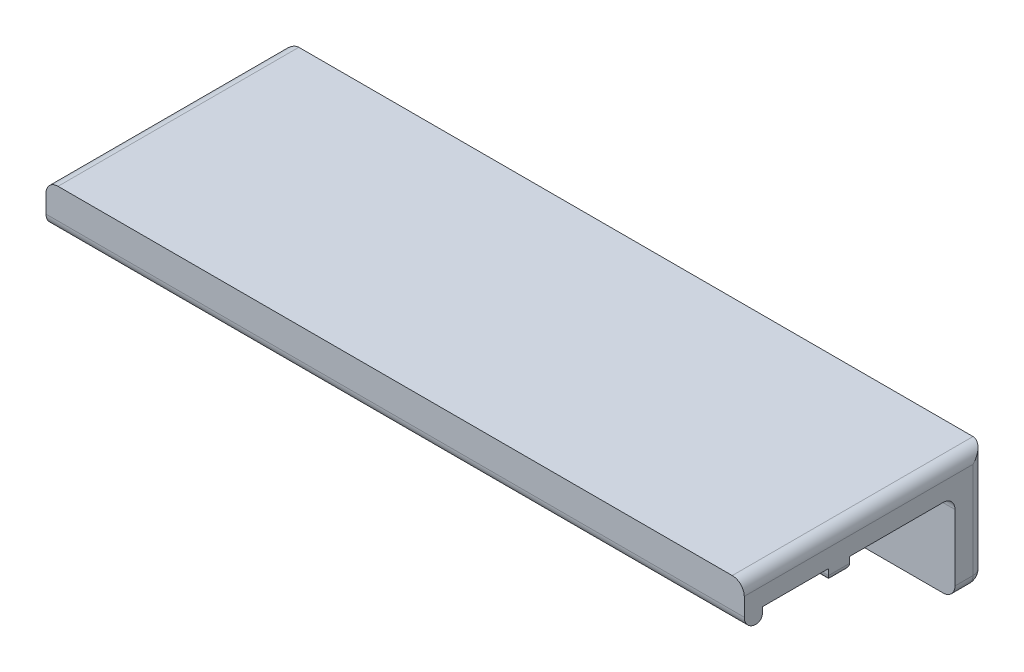
ISO-10303-21;
HEADER;
FILE_DESCRIPTION(('STEP AP214'),'2;1');
FILE_NAME('part.step','',(''),(''),'','','');
FILE_SCHEMA(('AUTOMOTIVE_DESIGN { 1 0 10303 214 1 1 1 1 }'));
ENDSEC;
DATA;
#1=APPLICATION_CONTEXT('core data for automotive mechanical design processes');
#2=APPLICATION_PROTOCOL_DEFINITION('international standard','automotive_design',2000,#1);
#3=PRODUCT_CONTEXT('',#1,'mechanical');
#4=PRODUCT('Part','Part','',(#3));
#5=PRODUCT_RELATED_PRODUCT_CATEGORY('part','',(#4));
#6=PRODUCT_DEFINITION_FORMATION('','',#4);
#7=PRODUCT_DEFINITION_CONTEXT('part definition',#1,'design');
#8=PRODUCT_DEFINITION('design','',#6,#7);
#9=PRODUCT_DEFINITION_SHAPE('','',#8);
#10=(LENGTH_UNIT() NAMED_UNIT(*) SI_UNIT(.MILLI.,.METRE.));
#11=(NAMED_UNIT(*) PLANE_ANGLE_UNIT() SI_UNIT($,.RADIAN.));
#12=(NAMED_UNIT(*) SI_UNIT($,.STERADIAN.) SOLID_ANGLE_UNIT());
#13=UNCERTAINTY_MEASURE_WITH_UNIT(LENGTH_MEASURE(1.E-05),#10,'distance_accuracy_value','');
#14=(GEOMETRIC_REPRESENTATION_CONTEXT(3) GLOBAL_UNCERTAINTY_ASSIGNED_CONTEXT((#13)) GLOBAL_UNIT_ASSIGNED_CONTEXT((#10,
#11,#12)) REPRESENTATION_CONTEXT('',''));
#15=CARTESIAN_POINT('',(0.,0.,0.));
#16=DIRECTION('',(0.,0.,1.));
#17=DIRECTION('',(1.,0.,0.));
#18=AXIS2_PLACEMENT_3D('',#15,#16,#17);
#19=CARTESIAN_POINT('',(0.,15.,40.));
#20=DIRECTION('',(0.,1.,0.));
#21=DIRECTION('',(0.,0.,1.));
#22=AXIS2_PLACEMENT_3D('',#19,#20,#21);
#23=PLANE('',#22);
#24=DIRECTION('',(0.,0.,-1.));
#25=VECTOR('',#24,1.);
#26=CARTESIAN_POINT('',(0.,15.,40.));
#27=LINE('',#26,#25);
#28=CARTESIAN_POINT('',(0.,15.,22.5));
#29=VERTEX_POINT('',#28);
#30=CARTESIAN_POINT('',(0.,15.,7.));
#31=VERTEX_POINT('',#30);
#32=EDGE_CURVE('E195',#29,#31,#27,.T.);
#33=ORIENTED_EDGE('',*,*,#32,.T.);
#34=DIRECTION('',(1.,0.,0.));
#35=VECTOR('',#34,1.);
#36=CARTESIAN_POINT('',(116.,15.,7.));
#37=LINE('',#36,#35);
#38=CARTESIAN_POINT('',(116.,15.,7.));
#39=VERTEX_POINT('',#38);
#40=EDGE_CURVE('E348',#31,#39,#37,.T.);
#41=ORIENTED_EDGE('',*,*,#40,.T.);
#42=DIRECTION('',(0.,0.,-1.));
#43=VECTOR('',#42,1.);
#44=CARTESIAN_POINT('',(116.,15.,40.));
#45=LINE('',#44,#43);
#46=CARTESIAN_POINT('',(116.,15.,22.5));
#47=VERTEX_POINT('',#46);
#48=EDGE_CURVE('E205',#47,#39,#45,.T.);
#49=ORIENTED_EDGE('',*,*,#48,.F.);
#50=DIRECTION('',(1.,0.,0.));
#51=VECTOR('',#50,1.);
#52=CARTESIAN_POINT('',(0.,15.,22.5));
#53=LINE('',#52,#51);
#54=EDGE_CURVE('E186',#29,#47,#53,.T.);
#55=ORIENTED_EDGE('',*,*,#54,.F.);
#56=EDGE_LOOP('',(#33,#41,#49,#55));
#57=FACE_BOUND('',#56,.T.);
#58=ADVANCED_FACE('F39',(#57),#23,.F.);
#59=DIRECTION('',(-1.,0.,0.));
#60=VECTOR('',#59,1.);
#61=CARTESIAN_POINT('',(0.,15.,26.));
#62=LINE('',#61,#60);
#63=CARTESIAN_POINT('',(116.,15.,26.));
#64=VERTEX_POINT('',#63);
#65=CARTESIAN_POINT('',(0.,15.,26.));
#66=VERTEX_POINT('',#65);
#67=EDGE_CURVE('E207',#64,#66,#62,.T.);
#68=ORIENTED_EDGE('',*,*,#67,.F.);
#69=CARTESIAN_POINT('',(116.,15.,37.));
#70=VERTEX_POINT('',#69);
#71=EDGE_CURVE('E202',#70,#64,#45,.T.);
#72=ORIENTED_EDGE('',*,*,#71,.F.);
#73=DIRECTION('',(1.,0.,0.));
#74=VECTOR('',#73,1.);
#75=CARTESIAN_POINT('',(0.,15.,37.));
#76=LINE('',#75,#74);
#77=CARTESIAN_POINT('',(0.,15.,37.));
#78=VERTEX_POINT('',#77);
#79=EDGE_CURVE('E206',#78,#70,#76,.T.);
#80=ORIENTED_EDGE('',*,*,#79,.F.);
#81=EDGE_CURVE('E201',#78,#66,#27,.T.);
#82=ORIENTED_EDGE('',*,*,#81,.T.);
#83=EDGE_LOOP('',(#68,#72,#80,#82));
#84=FACE_BOUND('',#83,.T.);
#85=ADVANCED_FACE('F375',(#84),#23,.F.);
#86=CARTESIAN_POINT('',(2.,2.,5.));
#87=DIRECTION('',(0.,0.,-1.));
#88=DIRECTION('',(-1.,0.,0.));
#89=AXIS2_PLACEMENT_3D('',#86,#87,#88);
#90=PLANE('',#89);
#91=CARTESIAN_POINT('',(96.,9.,5.));
#92=DIRECTION('',(0.,0.,1.));
#93=DIRECTION('',(1.,0.,0.));
#94=AXIS2_PLACEMENT_3D('',#91,#92,#93);
#95=CIRCLE('',#94,2.);
#96=CARTESIAN_POINT('',(98.,9.,5.));
#97=VERTEX_POINT('',#96);
#98=EDGE_CURVE('E233',#97,#97,#95,.T.);
#99=ORIENTED_EDGE('',*,*,#98,.F.);
#100=EDGE_LOOP('',(#99));
#101=FACE_BOUND('',#100,.T.);
#102=CARTESIAN_POINT('',(20.,9.,5.));
#103=DIRECTION('',(0.,0.,1.));
#104=DIRECTION('',(1.,0.,0.));
#105=AXIS2_PLACEMENT_3D('',#102,#103,#104);
#106=CIRCLE('',#105,2.);
#107=CARTESIAN_POINT('',(22.,9.,5.));
#108=VERTEX_POINT('',#107);
#109=EDGE_CURVE('E239',#108,#108,#106,.T.);
#110=ORIENTED_EDGE('',*,*,#109,.F.);
#111=EDGE_LOOP('',(#110));
#112=FACE_BOUND('',#111,.T.);
#113=DIRECTION('',(0.,1.,0.));
#114=VECTOR('',#113,1.);
#115=CARTESIAN_POINT('',(116.,2.00000000000001,5.));
#116=LINE('',#115,#114);
#117=CARTESIAN_POINT('',(116.,2.,5.));
#118=VERTEX_POINT('',#117);
#119=CARTESIAN_POINT('',(116.,13.,5.));
#120=VERTEX_POINT('',#119);
#121=EDGE_CURVE('E245',#118,#120,#116,.T.);
#122=ORIENTED_EDGE('',*,*,#121,.T.);
#123=DIRECTION('',(1.,0.,0.));
#124=VECTOR('',#123,1.);
#125=CARTESIAN_POINT('',(0.,13.,5.));
#126=LINE('',#125,#124);
#127=CARTESIAN_POINT('',(0.,13.,5.));
#128=VERTEX_POINT('',#127);
#129=EDGE_CURVE('E60',#120,#128,#126,.F.);
#130=ORIENTED_EDGE('',*,*,#129,.T.);
#131=DIRECTION('',(0.,-1.,0.));
#132=VECTOR('',#131,1.);
#133=CARTESIAN_POINT('',(0.,2.00000000000001,5.));
#134=LINE('',#133,#132);
#135=CARTESIAN_POINT('',(0.,2.00000000000001,5.));
#136=VERTEX_POINT('',#135);
#137=EDGE_CURVE('E247',#128,#136,#134,.T.);
#138=ORIENTED_EDGE('',*,*,#137,.T.);
#139=CARTESIAN_POINT('',(2.,2.,5.));
#140=DIRECTION('',(0.,0.,1.));
#141=DIRECTION('',(-1.,0.,0.));
#142=AXIS2_PLACEMENT_3D('',#139,#140,#141);
#143=CIRCLE('',#142,2.);
#144=CARTESIAN_POINT('',(2.00000000000001,0.,5.));
#145=VERTEX_POINT('',#144);
#146=EDGE_CURVE('E249',#136,#145,#143,.T.);
#147=ORIENTED_EDGE('',*,*,#146,.T.);
#148=DIRECTION('',(1.,0.,0.));
#149=VECTOR('',#148,1.);
#150=CARTESIAN_POINT('',(2.00000000000001,0.,5.));
#151=LINE('',#150,#149);
#152=CARTESIAN_POINT('',(114.,0.,5.));
#153=VERTEX_POINT('',#152);
#154=EDGE_CURVE('E251',#145,#153,#151,.T.);
#155=ORIENTED_EDGE('',*,*,#154,.T.);
#156=CARTESIAN_POINT('',(114.,2.,5.));
#157=DIRECTION('',(0.,0.,1.));
#158=DIRECTION('',(1.,0.,0.));
#159=AXIS2_PLACEMENT_3D('',#156,#157,#158);
#160=CIRCLE('',#159,2.);
#161=EDGE_CURVE('E253',#153,#118,#160,.T.);
#162=ORIENTED_EDGE('',*,*,#161,.T.);
#163=EDGE_LOOP('',(#122,#130,#138,#147,#155,#162));
#164=FACE_BOUND('',#163,.T.);
#165=ADVANCED_FACE('F411',(#101,#112,#164),#90,.F.);
#166=CARTESIAN_POINT('',(2.,2.,0.));
#167=DIRECTION('',(0.,0.,-1.));
#168=DIRECTION('',(-1.,0.,0.));
#169=AXIS2_PLACEMENT_3D('',#166,#167,#168);
#170=PLANE('',#169);
#171=CARTESIAN_POINT('',(20.,9.,0.));
#172=DIRECTION('',(0.,0.,1.));
#173=DIRECTION('',(1.,0.,0.));
#174=AXIS2_PLACEMENT_3D('',#171,#172,#173);
#175=CIRCLE('',#174,2.);
#176=CARTESIAN_POINT('',(22.,9.,0.));
#177=VERTEX_POINT('',#176);
#178=EDGE_CURVE('E236',#177,#177,#175,.T.);
#179=ORIENTED_EDGE('',*,*,#178,.T.);
#180=EDGE_LOOP('',(#179));
#181=FACE_BOUND('',#180,.T.);
#182=DIRECTION('',(1.,0.,0.));
#183=VECTOR('',#182,1.);
#184=CARTESIAN_POINT('',(2.00000000000001,2.,0.));
#185=LINE('',#184,#183);
#186=CARTESIAN_POINT('',(114.,2.,0.));
#187=VERTEX_POINT('',#186);
#188=CARTESIAN_POINT('',(2.,2.,0.));
#189=VERTEX_POINT('',#188);
#190=EDGE_CURVE('E278',#187,#189,#185,.F.);
#191=ORIENTED_EDGE('',*,*,#190,.T.);
#192=DIRECTION('',(0.,-1.,0.));
#193=VECTOR('',#192,1.);
#194=CARTESIAN_POINT('',(2.,20.,0.));
#195=LINE('',#194,#193);
#196=CARTESIAN_POINT('',(2.,20.,0.));
#197=VERTEX_POINT('',#196);
#198=EDGE_CURVE('E280',#189,#197,#195,.F.);
#199=ORIENTED_EDGE('',*,*,#198,.T.);
#200=DIRECTION('',(-1.,0.,0.));
#201=VECTOR('',#200,1.);
#202=CARTESIAN_POINT('',(0.,20.,0.));
#203=LINE('',#202,#201);
#204=CARTESIAN_POINT('',(114.,20.,0.));
#205=VERTEX_POINT('',#204);
#206=EDGE_CURVE('E242',#205,#197,#203,.T.);
#207=ORIENTED_EDGE('',*,*,#206,.F.);
#208=DIRECTION('',(0.,1.,0.));
#209=VECTOR('',#208,1.);
#210=CARTESIAN_POINT('',(114.,2.,0.));
#211=LINE('',#210,#209);
#212=EDGE_CURVE('E276',#205,#187,#211,.F.);
#213=ORIENTED_EDGE('',*,*,#212,.T.);
#214=EDGE_LOOP('',(#191,#199,#207,#213));
#215=FACE_BOUND('',#214,.T.);
#216=CARTESIAN_POINT('',(96.,9.,0.));
#217=DIRECTION('',(0.,0.,1.));
#218=DIRECTION('',(1.,0.,0.));
#219=AXIS2_PLACEMENT_3D('',#216,#217,#218);
#220=CIRCLE('',#219,2.);
#221=CARTESIAN_POINT('',(98.,9.,0.));
#222=VERTEX_POINT('',#221);
#223=EDGE_CURVE('E232',#222,#222,#220,.T.);
#224=ORIENTED_EDGE('',*,*,#223,.T.);
#225=EDGE_LOOP('',(#224));
#226=FACE_BOUND('',#225,.T.);
#227=ADVANCED_FACE('F438',(#181,#215,#226),#170,.T.);
#228=CARTESIAN_POINT('',(116.,2.00000000000001,5.));
#229=DIRECTION('',(-1.,0.,0.));
#230=DIRECTION('',(0.,0.,1.));
#231=AXIS2_PLACEMENT_3D('',#228,#229,#230);
#232=PLANE('',#231);
#233=DIRECTION('',(0.,1.,0.));
#234=VECTOR('',#233,1.);
#235=CARTESIAN_POINT('',(116.,13.,26.));
#236=LINE('',#235,#234);
#237=CARTESIAN_POINT('',(116.,14.,26.));
#238=VERTEX_POINT('',#237);
#239=EDGE_CURVE('E363',#238,#64,#236,.T.);
#240=ORIENTED_EDGE('',*,*,#239,.F.);
#241=DIRECTION('',(0.,0.,1.));
#242=VECTOR('',#241,1.);
#243=CARTESIAN_POINT('',(116.,14.,22.5));
#244=LINE('',#243,#242);
#245=CARTESIAN_POINT('',(116.,14.,22.5));
#246=VERTEX_POINT('',#245);
#247=EDGE_CURVE('E339',#238,#246,#244,.F.);
#248=ORIENTED_EDGE('',*,*,#247,.T.);
#249=DIRECTION('',(0.,1.,0.));
#250=VECTOR('',#249,1.);
#251=CARTESIAN_POINT('',(116.,13.,22.5));
#252=LINE('',#251,#250);
#253=EDGE_CURVE('E191',#246,#47,#252,.T.);
#254=ORIENTED_EDGE('',*,*,#253,.T.);
#255=ORIENTED_EDGE('',*,*,#48,.T.);
#256=CARTESIAN_POINT('',(116.,13.,7.));
#257=DIRECTION('',(-1.,0.,0.));
#258=DIRECTION('',(0.,0.,1.));
#259=AXIS2_PLACEMENT_3D('',#256,#257,#258);
#260=CIRCLE('',#259,2.);
#261=EDGE_CURVE('E47',#39,#120,#260,.T.);
#262=ORIENTED_EDGE('',*,*,#261,.T.);
#263=ORIENTED_EDGE('',*,*,#121,.F.);
#264=DIRECTION('',(0.,0.,-1.));
#265=VECTOR('',#264,1.);
#266=CARTESIAN_POINT('',(116.,2.,5.));
#267=LINE('',#266,#265);
#268=CARTESIAN_POINT('',(116.,2.,2.));
#269=VERTEX_POINT('',#268);
#270=EDGE_CURVE('E255',#118,#269,#267,.T.);
#271=ORIENTED_EDGE('',*,*,#270,.T.);
#272=DIRECTION('',(0.,1.,0.));
#273=VECTOR('',#272,1.);
#274=CARTESIAN_POINT('',(116.,20.,2.));
#275=LINE('',#274,#273);
#276=CARTESIAN_POINT('',(116.,18.,2.));
#277=VERTEX_POINT('',#276);
#278=EDGE_CURVE('E299',#269,#277,#275,.T.);
#279=ORIENTED_EDGE('',*,*,#278,.T.);
#280=DIRECTION('',(0.,0.,-1.));
#281=VECTOR('',#280,1.);
#282=CARTESIAN_POINT('',(116.,18.,5.));
#283=LINE('',#282,#281);
#284=CARTESIAN_POINT('',(116.,18.,40.));
#285=VERTEX_POINT('',#284);
#286=EDGE_CURVE('E297',#277,#285,#283,.F.);
#287=ORIENTED_EDGE('',*,*,#286,.T.);
#288=DIRECTION('',(0.,1.,0.));
#289=VECTOR('',#288,1.);
#290=CARTESIAN_POINT('',(116.,20.,40.));
#291=LINE('',#290,#289);
#292=CARTESIAN_POINT('',(116.,15.,40.));
#293=VERTEX_POINT('',#292);
#294=EDGE_CURVE('E223',#293,#285,#291,.T.);
#295=ORIENTED_EDGE('',*,*,#294,.F.);
#296=CARTESIAN_POINT('',(116.,15.,38.));
#297=DIRECTION('',(-1.,0.,0.));
#298=DIRECTION('',(0.,0.,1.));
#299=AXIS2_PLACEMENT_3D('',#296,#297,#298);
#300=CIRCLE('',#299,2.);
#301=CARTESIAN_POINT('',(116.,13.,38.));
#302=VERTEX_POINT('',#301);
#303=EDGE_CURVE('E301',#293,#302,#300,.F.);
#304=ORIENTED_EDGE('',*,*,#303,.T.);
#305=CARTESIAN_POINT('',(116.,14.,38.));
#306=DIRECTION('',(-1.,0.,0.));
#307=DIRECTION('',(0.,0.,1.));
#308=AXIS2_PLACEMENT_3D('',#305,#306,#307);
#309=CIRCLE('',#308,1.);
#310=CARTESIAN_POINT('',(116.,14.,37.));
#311=VERTEX_POINT('',#310);
#312=EDGE_CURVE('E337',#302,#311,#309,.F.);
#313=ORIENTED_EDGE('',*,*,#312,.T.);
#314=DIRECTION('',(0.,1.,0.));
#315=VECTOR('',#314,1.);
#316=CARTESIAN_POINT('',(116.,13.,37.));
#317=LINE('',#316,#315);
#318=EDGE_CURVE('E210',#311,#70,#317,.T.);
#319=ORIENTED_EDGE('',*,*,#318,.T.);
#320=ORIENTED_EDGE('',*,*,#71,.T.);
#321=EDGE_LOOP('',(#240,#248,#254,#255,#262,#263,#271,#279,#287,#295,#304,#313,#319,#320));
#322=FACE_BOUND('',#321,.T.);
#323=ADVANCED_FACE('F361',(#322),#232,.F.);
#324=CARTESIAN_POINT('',(0.,20.,5.));
#325=DIRECTION('',(0.,-1.,0.));
#326=DIRECTION('',(0.,0.,-1.));
#327=AXIS2_PLACEMENT_3D('',#324,#325,#326);
#328=PLANE('',#327);
#329=ORIENTED_EDGE('',*,*,#206,.T.);
#330=DIRECTION('',(0.,0.,-1.));
#331=VECTOR('',#330,1.);
#332=CARTESIAN_POINT('',(2.,20.,5.));
#333=LINE('',#332,#331);
#334=CARTESIAN_POINT('',(2.,20.,40.));
#335=VERTEX_POINT('',#334);
#336=EDGE_CURVE('E306',#197,#335,#333,.F.);
#337=ORIENTED_EDGE('',*,*,#336,.T.);
#338=DIRECTION('',(-1.,0.,0.));
#339=VECTOR('',#338,1.);
#340=CARTESIAN_POINT('',(0.,20.,40.));
#341=LINE('',#340,#339);
#342=CARTESIAN_POINT('',(114.,20.,40.));
#343=VERTEX_POINT('',#342);
#344=EDGE_CURVE('E226',#343,#335,#341,.T.);
#345=ORIENTED_EDGE('',*,*,#344,.F.);
#346=DIRECTION('',(0.,0.,-1.));
#347=VECTOR('',#346,1.);
#348=CARTESIAN_POINT('',(114.,20.,5.));
#349=LINE('',#348,#347);
#350=EDGE_CURVE('E304',#343,#205,#349,.T.);
#351=ORIENTED_EDGE('',*,*,#350,.T.);
#352=EDGE_LOOP('',(#329,#337,#345,#351));
#353=FACE_BOUND('',#352,.T.);
#354=ADVANCED_FACE('F453',(#353),#328,.F.);
#355=CARTESIAN_POINT('',(0.,2.00000000000001,5.));
#356=DIRECTION('',(1.,0.,0.));
#357=DIRECTION('',(0.,0.,-1.));
#358=AXIS2_PLACEMENT_3D('',#355,#356,#357);
#359=PLANE('',#358);
#360=DIRECTION('',(0.,1.,0.));
#361=VECTOR('',#360,1.);
#362=CARTESIAN_POINT('',(0.,13.,22.5));
#363=LINE('',#362,#361);
#364=CARTESIAN_POINT('',(0.,14.,22.5));
#365=VERTEX_POINT('',#364);
#366=EDGE_CURVE('E181',#365,#29,#363,.T.);
#367=ORIENTED_EDGE('',*,*,#366,.F.);
#368=DIRECTION('',(0.,0.,-1.));
#369=VECTOR('',#368,1.);
#370=CARTESIAN_POINT('',(0.,14.,26.));
#371=LINE('',#370,#369);
#372=CARTESIAN_POINT('',(0.,14.,26.));
#373=VERTEX_POINT('',#372);
#374=EDGE_CURVE('E344',#365,#373,#371,.F.);
#375=ORIENTED_EDGE('',*,*,#374,.T.);
#376=DIRECTION('',(0.,1.,0.));
#377=VECTOR('',#376,1.);
#378=CARTESIAN_POINT('',(0.,13.,26.));
#379=LINE('',#378,#377);
#380=EDGE_CURVE('E213',#373,#66,#379,.T.);
#381=ORIENTED_EDGE('',*,*,#380,.T.);
#382=ORIENTED_EDGE('',*,*,#81,.F.);
#383=DIRECTION('',(0.,1.,0.));
#384=VECTOR('',#383,1.);
#385=CARTESIAN_POINT('',(0.,13.,37.));
#386=LINE('',#385,#384);
#387=CARTESIAN_POINT('',(0.,14.,37.));
#388=VERTEX_POINT('',#387);
#389=EDGE_CURVE('E218',#388,#78,#386,.T.);
#390=ORIENTED_EDGE('',*,*,#389,.F.);
#391=CARTESIAN_POINT('',(0.,14.,38.));
#392=DIRECTION('',(1.,0.,0.));
#393=DIRECTION('',(0.,0.,-1.));
#394=AXIS2_PLACEMENT_3D('',#391,#392,#393);
#395=CIRCLE('',#394,1.);
#396=CARTESIAN_POINT('',(0.,13.,38.));
#397=VERTEX_POINT('',#396);
#398=EDGE_CURVE('E342',#388,#397,#395,.F.);
#399=ORIENTED_EDGE('',*,*,#398,.T.);
#400=CARTESIAN_POINT('',(0.,15.,38.));
#401=DIRECTION('',(1.,0.,0.));
#402=DIRECTION('',(0.,0.,-1.));
#403=AXIS2_PLACEMENT_3D('',#400,#401,#402);
#404=CIRCLE('',#403,2.);
#405=CARTESIAN_POINT('',(0.,15.,40.));
#406=VERTEX_POINT('',#405);
#407=EDGE_CURVE('E274',#397,#406,#404,.F.);
#408=ORIENTED_EDGE('',*,*,#407,.T.);
#409=DIRECTION('',(0.,-1.,0.));
#410=VECTOR('',#409,1.);
#411=CARTESIAN_POINT('',(0.,20.,40.));
#412=LINE('',#411,#410);
#413=CARTESIAN_POINT('',(0.,18.,40.));
#414=VERTEX_POINT('',#413);
#415=EDGE_CURVE('E220',#414,#406,#412,.T.);
#416=ORIENTED_EDGE('',*,*,#415,.F.);
#417=DIRECTION('',(0.,0.,-1.));
#418=VECTOR('',#417,1.);
#419=CARTESIAN_POINT('',(0.,18.,5.));
#420=LINE('',#419,#418);
#421=CARTESIAN_POINT('',(0.,18.,2.));
#422=VERTEX_POINT('',#421);
#423=EDGE_CURVE('E269',#414,#422,#420,.T.);
#424=ORIENTED_EDGE('',*,*,#423,.T.);
#425=DIRECTION('',(0.,-1.,0.));
#426=VECTOR('',#425,1.);
#427=CARTESIAN_POINT('',(0.,2.00000000000001,2.));
#428=LINE('',#427,#426);
#429=CARTESIAN_POINT('',(0.,2.00000000000001,2.));
#430=VERTEX_POINT('',#429);
#431=EDGE_CURVE('E271',#422,#430,#428,.T.);
#432=ORIENTED_EDGE('',*,*,#431,.T.);
#433=DIRECTION('',(0.,0.,-1.));
#434=VECTOR('',#433,1.);
#435=CARTESIAN_POINT('',(0.,2.00000000000001,5.));
#436=LINE('',#435,#434);
#437=EDGE_CURVE('E266',#136,#430,#436,.T.);
#438=ORIENTED_EDGE('',*,*,#437,.F.);
#439=ORIENTED_EDGE('',*,*,#137,.F.);
#440=CARTESIAN_POINT('',(0.,13.,7.));
#441=DIRECTION('',(1.,0.,0.));
#442=DIRECTION('',(0.,0.,-1.));
#443=AXIS2_PLACEMENT_3D('',#440,#441,#442);
#444=CIRCLE('',#443,2.);
#445=EDGE_CURVE('E11',#128,#31,#444,.T.);
#446=ORIENTED_EDGE('',*,*,#445,.T.);
#447=ORIENTED_EDGE('',*,*,#32,.F.);
#448=EDGE_LOOP('',(#367,#375,#381,#382,#390,#399,#408,#416,#424,#432,#438,#439,#446,#447));
#449=FACE_BOUND('',#448,.T.);
#450=ADVANCED_FACE('F196',(#449),#359,.F.);
#451=CARTESIAN_POINT('',(2.,2.,5.));
#452=DIRECTION('',(0.,0.,-1.));
#453=DIRECTION('',(-1.,0.,0.));
#454=AXIS2_PLACEMENT_3D('',#451,#452,#453);
#455=CYLINDRICAL_SURFACE('',#454,2.);
#456=ORIENTED_EDGE('',*,*,#437,.T.);
#457=CARTESIAN_POINT('',(2.,2.,2.));
#458=DIRECTION('',(0.,0.,-1.));
#459=DIRECTION('',(-1.,0.,0.));
#460=AXIS2_PLACEMENT_3D('',#457,#458,#459);
#461=CIRCLE('',#460,2.);
#462=CARTESIAN_POINT('',(2.00000000000001,0.,2.));
#463=VERTEX_POINT('',#462);
#464=EDGE_CURVE('E282',#430,#463,#461,.F.);
#465=ORIENTED_EDGE('',*,*,#464,.T.);
#466=DIRECTION('',(0.,0.,-1.));
#467=VECTOR('',#466,1.);
#468=CARTESIAN_POINT('',(2.00000000000001,0.,5.));
#469=LINE('',#468,#467);
#470=EDGE_CURVE('E263',#145,#463,#469,.T.);
#471=ORIENTED_EDGE('',*,*,#470,.F.);
#472=ORIENTED_EDGE('',*,*,#146,.F.);
#473=EDGE_LOOP('',(#456,#465,#471,#472));
#474=FACE_BOUND('',#473,.T.);
#475=ADVANCED_FACE('F407',(#474),#455,.T.);
#476=CARTESIAN_POINT('',(2.00000000000001,0.,5.));
#477=DIRECTION('',(0.,1.,0.));
#478=DIRECTION('',(0.,0.,1.));
#479=AXIS2_PLACEMENT_3D('',#476,#477,#478);
#480=PLANE('',#479);
#481=ORIENTED_EDGE('',*,*,#470,.T.);
#482=DIRECTION('',(1.,0.,0.));
#483=VECTOR('',#482,1.);
#484=CARTESIAN_POINT('',(114.,0.,2.));
#485=LINE('',#484,#483);
#486=CARTESIAN_POINT('',(114.,0.,2.));
#487=VERTEX_POINT('',#486);
#488=EDGE_CURVE('E284',#463,#487,#485,.T.);
#489=ORIENTED_EDGE('',*,*,#488,.T.);
#490=DIRECTION('',(0.,0.,-1.));
#491=VECTOR('',#490,1.);
#492=CARTESIAN_POINT('',(114.,0.,5.));
#493=LINE('',#492,#491);
#494=EDGE_CURVE('E260',#153,#487,#493,.T.);
#495=ORIENTED_EDGE('',*,*,#494,.F.);
#496=ORIENTED_EDGE('',*,*,#154,.F.);
#497=EDGE_LOOP('',(#481,#489,#495,#496));
#498=FACE_BOUND('',#497,.T.);
#499=ADVANCED_FACE('F445',(#498),#480,.F.);
#500=CARTESIAN_POINT('',(114.,2.,5.));
#501=DIRECTION('',(0.,0.,-1.));
#502=DIRECTION('',(-1.,0.,0.));
#503=AXIS2_PLACEMENT_3D('',#500,#501,#502);
#504=CYLINDRICAL_SURFACE('',#503,2.);
#505=ORIENTED_EDGE('',*,*,#494,.T.);
#506=CARTESIAN_POINT('',(114.,2.,2.));
#507=DIRECTION('',(0.,0.,-1.));
#508=DIRECTION('',(-1.,0.,0.));
#509=AXIS2_PLACEMENT_3D('',#506,#507,#508);
#510=CIRCLE('',#509,2.);
#511=EDGE_CURVE('E286',#487,#269,#510,.F.);
#512=ORIENTED_EDGE('',*,*,#511,.T.);
#513=ORIENTED_EDGE('',*,*,#270,.F.);
#514=ORIENTED_EDGE('',*,*,#161,.F.);
#515=EDGE_LOOP('',(#505,#512,#513,#514));
#516=FACE_BOUND('',#515,.T.);
#517=ADVANCED_FACE('F435',(#516),#504,.T.);
#518=CARTESIAN_POINT('',(20.,9.,5.));
#519=DIRECTION('',(0.,0.,-1.));
#520=DIRECTION('',(-1.,0.,0.));
#521=AXIS2_PLACEMENT_3D('',#518,#519,#520);
#522=CYLINDRICAL_SURFACE('',#521,2.);
#523=ORIENTED_EDGE('',*,*,#109,.T.);
#524=EDGE_LOOP('',(#523));
#525=FACE_BOUND('',#524,.T.);
#526=ORIENTED_EDGE('',*,*,#178,.F.);
#527=EDGE_LOOP('',(#526));
#528=FACE_BOUND('',#527,.T.);
#529=ADVANCED_FACE('F431',(#525,#528),#522,.F.);
#530=CARTESIAN_POINT('',(96.,9.,5.));
#531=DIRECTION('',(0.,0.,-1.));
#532=DIRECTION('',(-1.,0.,0.));
#533=AXIS2_PLACEMENT_3D('',#530,#531,#532);
#534=CYLINDRICAL_SURFACE('',#533,2.);
#535=ORIENTED_EDGE('',*,*,#98,.T.);
#536=EDGE_LOOP('',(#535));
#537=FACE_BOUND('',#536,.T.);
#538=ORIENTED_EDGE('',*,*,#223,.F.);
#539=EDGE_LOOP('',(#538));
#540=FACE_BOUND('',#539,.T.);
#541=ADVANCED_FACE('F428',(#537,#540),#534,.F.);
#542=CARTESIAN_POINT('',(0.,0.,40.));
#543=DIRECTION('',(0.,0.,1.));
#544=DIRECTION('',(1.,0.,0.));
#545=AXIS2_PLACEMENT_3D('',#542,#543,#544);
#546=PLANE('',#545);
#547=ORIENTED_EDGE('',*,*,#415,.T.);
#548=DIRECTION('',(-1.,0.,0.));
#549=VECTOR('',#548,1.);
#550=CARTESIAN_POINT('',(0.,15.,40.));
#551=LINE('',#550,#549);
#552=EDGE_CURVE('E295',#406,#293,#551,.F.);
#553=ORIENTED_EDGE('',*,*,#552,.T.);
#554=ORIENTED_EDGE('',*,*,#294,.T.);
#555=CARTESIAN_POINT('',(114.,18.,40.));
#556=DIRECTION('',(0.,0.,1.));
#557=DIRECTION('',(1.,0.,0.));
#558=AXIS2_PLACEMENT_3D('',#555,#556,#557);
#559=CIRCLE('',#558,2.);
#560=EDGE_CURVE('E291',#285,#343,#559,.T.);
#561=ORIENTED_EDGE('',*,*,#560,.T.);
#562=ORIENTED_EDGE('',*,*,#344,.T.);
#563=CARTESIAN_POINT('',(2.,18.,40.));
#564=DIRECTION('',(0.,0.,1.));
#565=DIRECTION('',(1.,0.,0.));
#566=AXIS2_PLACEMENT_3D('',#563,#564,#565);
#567=CIRCLE('',#566,2.);
#568=EDGE_CURVE('E293',#335,#414,#567,.T.);
#569=ORIENTED_EDGE('',*,*,#568,.T.);
#570=EDGE_LOOP('',(#547,#553,#554,#561,#562,#569));
#571=FACE_BOUND('',#570,.T.);
#572=ADVANCED_FACE('F394',(#571),#546,.T.);
#573=CARTESIAN_POINT('',(0.,13.,37.));
#574=DIRECTION('',(0.,0.,1.));
#575=DIRECTION('',(1.,0.,0.));
#576=AXIS2_PLACEMENT_3D('',#573,#574,#575);
#577=PLANE('',#576);
#578=ORIENTED_EDGE('',*,*,#318,.F.);
#579=DIRECTION('',(1.,0.,0.));
#580=VECTOR('',#579,1.);
#581=CARTESIAN_POINT('',(0.,14.,37.));
#582=LINE('',#581,#580);
#583=EDGE_CURVE('E346',#311,#388,#582,.F.);
#584=ORIENTED_EDGE('',*,*,#583,.T.);
#585=ORIENTED_EDGE('',*,*,#389,.T.);
#586=ORIENTED_EDGE('',*,*,#79,.T.);
#587=EDGE_LOOP('',(#578,#584,#585,#586));
#588=FACE_BOUND('',#587,.T.);
#589=ADVANCED_FACE('F381',(#588),#577,.F.);
#590=CARTESIAN_POINT('',(0.,13.,22.5));
#591=DIRECTION('',(0.,0.,1.));
#592=DIRECTION('',(1.,0.,0.));
#593=AXIS2_PLACEMENT_3D('',#590,#591,#592);
#594=PLANE('',#593);
#595=ORIENTED_EDGE('',*,*,#253,.F.);
#596=DIRECTION('',(1.,0.,0.));
#597=VECTOR('',#596,1.);
#598=CARTESIAN_POINT('',(0.,14.,22.5));
#599=LINE('',#598,#597);
#600=EDGE_CURVE('E188',#246,#365,#599,.F.);
#601=ORIENTED_EDGE('',*,*,#600,.T.);
#602=ORIENTED_EDGE('',*,*,#366,.T.);
#603=ORIENTED_EDGE('',*,*,#54,.T.);
#604=EDGE_LOOP('',(#595,#601,#602,#603));
#605=FACE_BOUND('',#604,.T.);
#606=ADVANCED_FACE('F184',(#605),#594,.F.);
#607=CARTESIAN_POINT('',(0.,13.,26.));
#608=DIRECTION('',(0.,0.,-1.));
#609=DIRECTION('',(-1.,0.,0.));
#610=AXIS2_PLACEMENT_3D('',#607,#608,#609);
#611=PLANE('',#610);
#612=ORIENTED_EDGE('',*,*,#380,.F.);
#613=DIRECTION('',(-1.,0.,0.));
#614=VECTOR('',#613,1.);
#615=CARTESIAN_POINT('',(116.,14.,26.));
#616=LINE('',#615,#614);
#617=EDGE_CURVE('E334',#373,#238,#616,.F.);
#618=ORIENTED_EDGE('',*,*,#617,.T.);
#619=ORIENTED_EDGE('',*,*,#239,.T.);
#620=ORIENTED_EDGE('',*,*,#67,.T.);
#621=EDGE_LOOP('',(#612,#618,#619,#620));
#622=FACE_BOUND('',#621,.T.);
#623=ADVANCED_FACE('F377',(#622),#611,.F.);
#624=CARTESIAN_POINT('',(0.,13.,0.));
#625=DIRECTION('',(0.,-1.,0.));
#626=DIRECTION('',(0.,0.,-1.));
#627=AXIS2_PLACEMENT_3D('',#624,#625,#626);
#628=PLANE('',#627);
#629=DIRECTION('',(0.,0.,1.));
#630=VECTOR('',#629,1.);
#631=CARTESIAN_POINT('',(115.,13.,26.));
#632=LINE('',#631,#630);
#633=CARTESIAN_POINT('',(115.,13.,23.5));
#634=VERTEX_POINT('',#633);
#635=CARTESIAN_POINT('',(115.,13.,25.));
#636=VERTEX_POINT('',#635);
#637=EDGE_CURVE('E329',#634,#636,#632,.T.);
#638=ORIENTED_EDGE('',*,*,#637,.T.);
#639=DIRECTION('',(-1.,0.,0.));
#640=VECTOR('',#639,1.);
#641=CARTESIAN_POINT('',(0.,13.,25.));
#642=LINE('',#641,#640);
#643=CARTESIAN_POINT('',(1.,13.,25.));
#644=VERTEX_POINT('',#643);
#645=EDGE_CURVE('E331',#636,#644,#642,.T.);
#646=ORIENTED_EDGE('',*,*,#645,.T.);
#647=DIRECTION('',(0.,0.,-1.));
#648=VECTOR('',#647,1.);
#649=CARTESIAN_POINT('',(1.,13.,22.5));
#650=LINE('',#649,#648);
#651=CARTESIAN_POINT('',(1.,13.,23.5));
#652=VERTEX_POINT('',#651);
#653=EDGE_CURVE('E308',#644,#652,#650,.T.);
#654=ORIENTED_EDGE('',*,*,#653,.T.);
#655=DIRECTION('',(1.,0.,0.));
#656=VECTOR('',#655,1.);
#657=CARTESIAN_POINT('',(116.,13.,23.5));
#658=LINE('',#657,#656);
#659=EDGE_CURVE('E327',#652,#634,#658,.T.);
#660=ORIENTED_EDGE('',*,*,#659,.T.);
#661=EDGE_LOOP('',(#638,#646,#654,#660));
#662=FACE_BOUND('',#661,.T.);
#663=ADVANCED_FACE('F483',(#662),#628,.T.);
#664=CARTESIAN_POINT('',(114.,18.,5.));
#665=DIRECTION('',(0.,0.,-1.));
#666=DIRECTION('',(-1.,0.,0.));
#667=AXIS2_PLACEMENT_3D('',#664,#665,#666);
#668=CYLINDRICAL_SURFACE('',#667,2.);
#669=ORIENTED_EDGE('',*,*,#560,.F.);
#670=ORIENTED_EDGE('',*,*,#286,.F.);
#671=CARTESIAN_POINT('',(114.,18.,2.));
#672=DIRECTION('',(0.,-0.707106781186547,-0.707106781186547));
#673=DIRECTION('',(0.,0.707106781186547,-0.707106781186547));
#674=AXIS2_PLACEMENT_3D('',#671,#672,#673);
#675=ELLIPSE('',#674,2.82842712474619,2.);
#676=EDGE_CURVE('E192',#205,#277,#675,.T.);
#677=ORIENTED_EDGE('',*,*,#676,.F.);
#678=ORIENTED_EDGE('',*,*,#350,.F.);
#679=EDGE_LOOP('',(#669,#670,#677,#678));
#680=FACE_BOUND('',#679,.T.);
#681=ADVANCED_FACE('F479',(#680),#668,.T.);
#682=CARTESIAN_POINT('',(114.,2.00000000000001,2.));
#683=DIRECTION('',(0.,-1.,0.));
#684=DIRECTION('',(0.,0.,-1.));
#685=AXIS2_PLACEMENT_3D('',#682,#683,#684);
#686=CYLINDRICAL_SURFACE('',#685,2.);
#687=ORIENTED_EDGE('',*,*,#676,.T.);
#688=ORIENTED_EDGE('',*,*,#278,.F.);
#689=CARTESIAN_POINT('',(114.,2.,2.));
#690=DIRECTION('',(0.,-1.,0.));
#691=DIRECTION('',(0.,0.,-1.));
#692=AXIS2_PLACEMENT_3D('',#689,#690,#691);
#693=CIRCLE('',#692,2.);
#694=EDGE_CURVE('E321',#187,#269,#693,.T.);
#695=ORIENTED_EDGE('',*,*,#694,.F.);
#696=ORIENTED_EDGE('',*,*,#212,.F.);
#697=EDGE_LOOP('',(#687,#688,#695,#696));
#698=FACE_BOUND('',#697,.T.);
#699=ADVANCED_FACE('F475',(#698),#686,.T.);
#700=CARTESIAN_POINT('',(114.,2.,2.));
#701=DIRECTION('',(0.,0.,-1.));
#702=DIRECTION('',(-1.,0.,0.));
#703=AXIS2_PLACEMENT_3D('',#700,#701,#702);
#704=SPHERICAL_SURFACE('',#703,2.);
#705=ORIENTED_EDGE('',*,*,#694,.T.);
#706=ORIENTED_EDGE('',*,*,#511,.F.);
#707=CARTESIAN_POINT('',(114.,2.,2.));
#708=DIRECTION('',(-1.,0.,0.));
#709=DIRECTION('',(0.,-1.,0.));
#710=AXIS2_PLACEMENT_3D('',#707,#708,#709);
#711=CIRCLE('',#710,2.);
#712=EDGE_CURVE('E318',#187,#487,#711,.T.);
#713=ORIENTED_EDGE('',*,*,#712,.F.);
#714=EDGE_LOOP('',(#705,#706,#713));
#715=FACE_BOUND('',#714,.T.);
#716=ADVANCED_FACE('F471',(#715),#704,.T.);
#717=CARTESIAN_POINT('',(2.00000000000001,2.,2.));
#718=DIRECTION('',(-1.,0.,0.));
#719=DIRECTION('',(0.,0.,1.));
#720=AXIS2_PLACEMENT_3D('',#717,#718,#719);
#721=CYLINDRICAL_SURFACE('',#720,2.);
#722=ORIENTED_EDGE('',*,*,#712,.T.);
#723=ORIENTED_EDGE('',*,*,#488,.F.);
#724=CARTESIAN_POINT('',(2.,2.,2.));
#725=DIRECTION('',(-1.,0.,0.));
#726=DIRECTION('',(0.,-1.,0.));
#727=AXIS2_PLACEMENT_3D('',#724,#725,#726);
#728=CIRCLE('',#727,2.);
#729=EDGE_CURVE('E315',#189,#463,#728,.T.);
#730=ORIENTED_EDGE('',*,*,#729,.F.);
#731=ORIENTED_EDGE('',*,*,#190,.F.);
#732=EDGE_LOOP('',(#722,#723,#730,#731));
#733=FACE_BOUND('',#732,.T.);
#734=ADVANCED_FACE('F468',(#733),#721,.T.);
#735=CARTESIAN_POINT('',(2.,18.,5.));
#736=DIRECTION('',(0.,0.,-1.));
#737=DIRECTION('',(-1.,0.,0.));
#738=AXIS2_PLACEMENT_3D('',#735,#736,#737);
#739=CYLINDRICAL_SURFACE('',#738,2.);
#740=ORIENTED_EDGE('',*,*,#568,.F.);
#741=ORIENTED_EDGE('',*,*,#336,.F.);
#742=CARTESIAN_POINT('',(2.,18.,2.));
#743=DIRECTION('',(0.,-0.707106781186547,-0.707106781186547));
#744=DIRECTION('',(0.,0.707106781186547,-0.707106781186547));
#745=AXIS2_PLACEMENT_3D('',#742,#743,#744);
#746=ELLIPSE('',#745,2.82842712474619,2.);
#747=EDGE_CURVE('E311',#422,#197,#746,.T.);
#748=ORIENTED_EDGE('',*,*,#747,.F.);
#749=ORIENTED_EDGE('',*,*,#423,.F.);
#750=EDGE_LOOP('',(#740,#741,#748,#749));
#751=FACE_BOUND('',#750,.T.);
#752=ADVANCED_FACE('F400',(#751),#739,.T.);
#753=CARTESIAN_POINT('',(2.,2.,2.));
#754=DIRECTION('',(0.,0.,-1.));
#755=DIRECTION('',(-1.,0.,0.));
#756=AXIS2_PLACEMENT_3D('',#753,#754,#755);
#757=SPHERICAL_SURFACE('',#756,2.);
#758=ORIENTED_EDGE('',*,*,#729,.T.);
#759=ORIENTED_EDGE('',*,*,#464,.F.);
#760=CARTESIAN_POINT('',(2.,2.,2.));
#761=DIRECTION('',(0.,1.,0.));
#762=DIRECTION('',(-1.,0.,0.));
#763=AXIS2_PLACEMENT_3D('',#760,#761,#762);
#764=CIRCLE('',#763,2.);
#765=EDGE_CURVE('E309',#189,#430,#764,.T.);
#766=ORIENTED_EDGE('',*,*,#765,.F.);
#767=EDGE_LOOP('',(#758,#759,#766));
#768=FACE_BOUND('',#767,.T.);
#769=ADVANCED_FACE('F462',(#768),#757,.T.);
#770=CARTESIAN_POINT('',(2.,2.00000000000001,2.));
#771=DIRECTION('',(0.,1.,0.));
#772=DIRECTION('',(0.,0.,1.));
#773=AXIS2_PLACEMENT_3D('',#770,#771,#772);
#774=CYLINDRICAL_SURFACE('',#773,2.);
#775=ORIENTED_EDGE('',*,*,#747,.T.);
#776=ORIENTED_EDGE('',*,*,#198,.F.);
#777=ORIENTED_EDGE('',*,*,#765,.T.);
#778=ORIENTED_EDGE('',*,*,#431,.F.);
#779=EDGE_LOOP('',(#775,#776,#777,#778));
#780=FACE_BOUND('',#779,.T.);
#781=ADVANCED_FACE('F459',(#780),#774,.T.);
#782=CARTESIAN_POINT('',(0.,15.,38.));
#783=DIRECTION('',(-1.,0.,0.));
#784=DIRECTION('',(0.,0.,1.));
#785=AXIS2_PLACEMENT_3D('',#782,#783,#784);
#786=CYLINDRICAL_SURFACE('',#785,2.);
#787=ORIENTED_EDGE('',*,*,#303,.F.);
#788=ORIENTED_EDGE('',*,*,#552,.F.);
#789=ORIENTED_EDGE('',*,*,#407,.F.);
#790=DIRECTION('',(-1.,0.,0.));
#791=VECTOR('',#790,1.);
#792=CARTESIAN_POINT('',(0.,13.,38.));
#793=LINE('',#792,#791);
#794=EDGE_CURVE('E288',#302,#397,#793,.T.);
#795=ORIENTED_EDGE('',*,*,#794,.F.);
#796=EDGE_LOOP('',(#787,#788,#789,#795));
#797=FACE_BOUND('',#796,.T.);
#798=ADVANCED_FACE('F389',(#797),#786,.T.);
#799=CARTESIAN_POINT('',(0.,14.,23.5));
#800=DIRECTION('',(-1.,0.,0.));
#801=DIRECTION('',(0.,0.,1.));
#802=AXIS2_PLACEMENT_3D('',#799,#800,#801);
#803=CYLINDRICAL_SURFACE('',#802,1.);
#804=CARTESIAN_POINT('',(1.,14.,23.5));
#805=DIRECTION('',(-0.707106781186547,0.,0.707106781186547));
#806=DIRECTION('',(0.707106781186547,0.,0.707106781186547));
#807=AXIS2_PLACEMENT_3D('',#804,#805,#806);
#808=ELLIPSE('',#807,1.41421356237309,1.);
#809=EDGE_CURVE('E353',#365,#652,#808,.T.);
#810=ORIENTED_EDGE('',*,*,#809,.F.);
#811=ORIENTED_EDGE('',*,*,#600,.F.);
#812=CARTESIAN_POINT('',(115.,14.,23.5));
#813=DIRECTION('',(-0.707106781186547,0.,-0.707106781186547));
#814=DIRECTION('',(-0.707106781186547,0.,0.707106781186547));
#815=AXIS2_PLACEMENT_3D('',#812,#813,#814);
#816=ELLIPSE('',#815,1.41421356237309,1.);
#817=EDGE_CURVE('E312',#634,#246,#816,.F.);
#818=ORIENTED_EDGE('',*,*,#817,.F.);
#819=ORIENTED_EDGE('',*,*,#659,.F.);
#820=EDGE_LOOP('',(#810,#811,#818,#819));
#821=FACE_BOUND('',#820,.T.);
#822=ADVANCED_FACE('F487',(#821),#803,.T.);
#823=CARTESIAN_POINT('',(115.,14.,0.));
#824=DIRECTION('',(0.,0.,-1.));
#825=DIRECTION('',(-1.,0.,0.));
#826=AXIS2_PLACEMENT_3D('',#823,#824,#825);
#827=CYLINDRICAL_SURFACE('',#826,1.);
#828=ORIENTED_EDGE('',*,*,#817,.T.);
#829=ORIENTED_EDGE('',*,*,#247,.F.);
#830=CARTESIAN_POINT('',(115.,14.,25.));
#831=DIRECTION('',(0.707106781186547,0.,-0.707106781186547));
#832=DIRECTION('',(-0.707106781186547,0.,-0.707106781186547));
#833=AXIS2_PLACEMENT_3D('',#830,#831,#832);
#834=ELLIPSE('',#833,1.41421356237309,1.);
#835=EDGE_CURVE('E351',#636,#238,#834,.F.);
#836=ORIENTED_EDGE('',*,*,#835,.F.);
#837=ORIENTED_EDGE('',*,*,#637,.F.);
#838=EDGE_LOOP('',(#828,#829,#836,#837));
#839=FACE_BOUND('',#838,.T.);
#840=ADVANCED_FACE('F494',(#839),#827,.T.);
#841=CARTESIAN_POINT('',(1.,14.,0.));
#842=DIRECTION('',(0.,0.,1.));
#843=DIRECTION('',(1.,0.,0.));
#844=AXIS2_PLACEMENT_3D('',#841,#842,#843);
#845=CYLINDRICAL_SURFACE('',#844,1.);
#846=ORIENTED_EDGE('',*,*,#809,.T.);
#847=ORIENTED_EDGE('',*,*,#653,.F.);
#848=CARTESIAN_POINT('',(1.,14.,25.));
#849=DIRECTION('',(0.707106781186547,0.,0.707106781186547));
#850=DIRECTION('',(-0.707106781186547,0.,0.707106781186547));
#851=AXIS2_PLACEMENT_3D('',#848,#849,#850);
#852=ELLIPSE('',#851,1.41421356237309,1.);
#853=EDGE_CURVE('E349',#373,#644,#852,.T.);
#854=ORIENTED_EDGE('',*,*,#853,.F.);
#855=ORIENTED_EDGE('',*,*,#374,.F.);
#856=EDGE_LOOP('',(#846,#847,#854,#855));
#857=FACE_BOUND('',#856,.T.);
#858=ADVANCED_FACE('F490',(#857),#845,.T.);
#859=CARTESIAN_POINT('',(0.,14.,25.));
#860=DIRECTION('',(1.,0.,0.));
#861=DIRECTION('',(0.,0.,-1.));
#862=AXIS2_PLACEMENT_3D('',#859,#860,#861);
#863=CYLINDRICAL_SURFACE('',#862,1.);
#864=ORIENTED_EDGE('',*,*,#835,.T.);
#865=ORIENTED_EDGE('',*,*,#617,.F.);
#866=ORIENTED_EDGE('',*,*,#853,.T.);
#867=ORIENTED_EDGE('',*,*,#645,.F.);
#868=EDGE_LOOP('',(#864,#865,#866,#867));
#869=FACE_BOUND('',#868,.T.);
#870=ADVANCED_FACE('F418',(#869),#863,.T.);
#871=CARTESIAN_POINT('',(0.,14.,38.));
#872=DIRECTION('',(-1.,0.,0.));
#873=DIRECTION('',(0.,0.,1.));
#874=AXIS2_PLACEMENT_3D('',#871,#872,#873);
#875=CYLINDRICAL_SURFACE('',#874,1.);
#876=ORIENTED_EDGE('',*,*,#398,.F.);
#877=ORIENTED_EDGE('',*,*,#583,.F.);
#878=ORIENTED_EDGE('',*,*,#312,.F.);
#879=ORIENTED_EDGE('',*,*,#794,.T.);
#880=EDGE_LOOP('',(#876,#877,#878,#879));
#881=FACE_BOUND('',#880,.T.);
#882=ADVANCED_FACE('F385',(#881),#875,.T.);
#883=CARTESIAN_POINT('',(0.,13.,7.));
#884=DIRECTION('',(-1.,0.,0.));
#885=DIRECTION('',(0.,0.,1.));
#886=AXIS2_PLACEMENT_3D('',#883,#884,#885);
#887=CYLINDRICAL_SURFACE('',#886,2.);
#888=ORIENTED_EDGE('',*,*,#445,.F.);
#889=ORIENTED_EDGE('',*,*,#129,.F.);
#890=ORIENTED_EDGE('',*,*,#261,.F.);
#891=ORIENTED_EDGE('',*,*,#40,.F.);
#892=EDGE_LOOP('',(#888,#889,#890,#891));
#893=FACE_BOUND('',#892,.T.);
#894=ADVANCED_FACE('F41',(#893),#887,.F.);
#895=CLOSED_SHELL('',(#58,#85,#165,#227,#323,#354,#450,#475,#499,#517,#529,#541,#572,#589,#606,
#623,#663,#681,#699,#716,#734,#752,#769,#781,#798,#822,#840,#858,#870,#882,#894));
#896=MANIFOLD_SOLID_BREP('B2',#895);
#897=ADVANCED_BREP_SHAPE_REPRESENTATION('',(#18,#896),#14);
#898=SHAPE_DEFINITION_REPRESENTATION(#9,#897);
ENDSEC;
END-ISO-10303-21;
